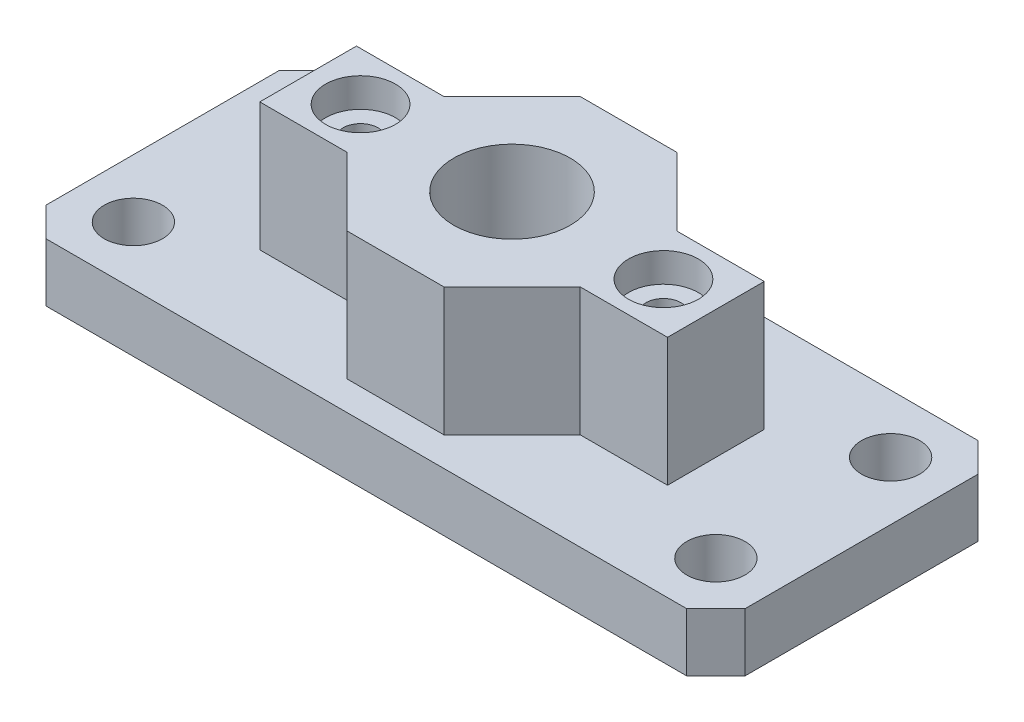
ISO-10303-21;
HEADER;
FILE_DESCRIPTION(('STEP AP214'),'2;1');
FILE_NAME('part.step','',(''),(''),'','','');
FILE_SCHEMA(('AUTOMOTIVE_DESIGN { 1 0 10303 214 1 1 1 1 }'));
ENDSEC;
DATA;
#1=APPLICATION_CONTEXT('core data for automotive mechanical design processes');
#2=APPLICATION_PROTOCOL_DEFINITION('international standard','automotive_design',2000,#1);
#3=PRODUCT_CONTEXT('',#1,'mechanical');
#4=PRODUCT('Part','Part','',(#3));
#5=PRODUCT_RELATED_PRODUCT_CATEGORY('part','',(#4));
#6=PRODUCT_DEFINITION_FORMATION('','',#4);
#7=PRODUCT_DEFINITION_CONTEXT('part definition',#1,'design');
#8=PRODUCT_DEFINITION('design','',#6,#7);
#9=PRODUCT_DEFINITION_SHAPE('','',#8);
#10=(LENGTH_UNIT() NAMED_UNIT(*) SI_UNIT(.MILLI.,.METRE.));
#11=(NAMED_UNIT(*) PLANE_ANGLE_UNIT() SI_UNIT($,.RADIAN.));
#12=(NAMED_UNIT(*) SI_UNIT($,.STERADIAN.) SOLID_ANGLE_UNIT());
#13=UNCERTAINTY_MEASURE_WITH_UNIT(LENGTH_MEASURE(1.E-05),#10,'distance_accuracy_value','');
#14=(GEOMETRIC_REPRESENTATION_CONTEXT(3) GLOBAL_UNCERTAINTY_ASSIGNED_CONTEXT((#13)) GLOBAL_UNIT_ASSIGNED_CONTEXT((#10,
#11,#12)) REPRESENTATION_CONTEXT('',''));
#15=CARTESIAN_POINT('',(0.,0.,0.));
#16=DIRECTION('',(0.,0.,1.));
#17=DIRECTION('',(1.,0.,0.));
#18=AXIS2_PLACEMENT_3D('',#15,#16,#17);
#19=CARTESIAN_POINT('',(60.,10.,0.));
#20=DIRECTION('',(1.,0.,0.));
#21=DIRECTION('',(0.,0.,-1.));
#22=AXIS2_PLACEMENT_3D('',#19,#20,#21);
#23=PLANE('',#22);
#24=DIRECTION('',(0.,0.,1.));
#25=VECTOR('',#24,1.);
#26=CARTESIAN_POINT('',(60.,10.,0.));
#27=LINE('',#26,#25);
#28=CARTESIAN_POINT('',(60.,10.,-20.));
#29=VERTEX_POINT('',#28);
#30=CARTESIAN_POINT('',(60.,10.,20.));
#31=VERTEX_POINT('',#30);
#32=EDGE_CURVE('E275',#29,#31,#27,.T.);
#33=ORIENTED_EDGE('',*,*,#32,.T.);
#34=DIRECTION('',(0.,-1.,0.));
#35=VECTOR('',#34,1.);
#36=CARTESIAN_POINT('',(60.,0.,20.));
#37=LINE('',#36,#35);
#38=CARTESIAN_POINT('',(60.,0.,20.));
#39=VERTEX_POINT('',#38);
#40=EDGE_CURVE('E356',#31,#39,#37,.T.);
#41=ORIENTED_EDGE('',*,*,#40,.T.);
#42=DIRECTION('',(0.,0.,1.));
#43=VECTOR('',#42,1.);
#44=CARTESIAN_POINT('',(60.,0.,0.));
#45=LINE('',#44,#43);
#46=CARTESIAN_POINT('',(60.,0.,-20.));
#47=VERTEX_POINT('',#46);
#48=EDGE_CURVE('E331',#47,#39,#45,.T.);
#49=ORIENTED_EDGE('',*,*,#48,.F.);
#50=DIRECTION('',(0.,1.,0.));
#51=VECTOR('',#50,1.);
#52=CARTESIAN_POINT('',(60.,10.,-20.));
#53=LINE('',#52,#51);
#54=EDGE_CURVE('E325',#47,#29,#53,.T.);
#55=ORIENTED_EDGE('',*,*,#54,.T.);
#56=EDGE_LOOP('',(#33,#41,#49,#55));
#57=FACE_BOUND('',#56,.T.);
#58=ADVANCED_FACE('F39',(#57),#23,.T.);
#59=CARTESIAN_POINT('',(0.,10.,-25.));
#60=DIRECTION('',(0.,0.,-1.));
#61=DIRECTION('',(-1.,0.,0.));
#62=AXIS2_PLACEMENT_3D('',#59,#60,#61);
#63=PLANE('',#62);
#64=DIRECTION('',(1.,0.,0.));
#65=VECTOR('',#64,1.);
#66=CARTESIAN_POINT('',(0.,10.,-25.));
#67=LINE('',#66,#65);
#68=CARTESIAN_POINT('',(-55.,10.,-25.));
#69=VERTEX_POINT('',#68);
#70=CARTESIAN_POINT('',(55.,10.,-25.));
#71=VERTEX_POINT('',#70);
#72=EDGE_CURVE('E278',#69,#71,#67,.T.);
#73=ORIENTED_EDGE('',*,*,#72,.T.);
#74=DIRECTION('',(0.,-1.,0.));
#75=VECTOR('',#74,1.);
#76=CARTESIAN_POINT('',(55.,10.,-25.));
#77=LINE('',#76,#75);
#78=CARTESIAN_POINT('',(55.,0.,-25.));
#79=VERTEX_POINT('',#78);
#80=EDGE_CURVE('E381',#71,#79,#77,.T.);
#81=ORIENTED_EDGE('',*,*,#80,.T.);
#82=DIRECTION('',(1.,0.,0.));
#83=VECTOR('',#82,1.);
#84=CARTESIAN_POINT('',(0.,0.,-25.));
#85=LINE('',#84,#83);
#86=CARTESIAN_POINT('',(-55.,0.,-25.));
#87=VERTEX_POINT('',#86);
#88=EDGE_CURVE('E334',#87,#79,#85,.T.);
#89=ORIENTED_EDGE('',*,*,#88,.F.);
#90=DIRECTION('',(0.,1.,0.));
#91=VECTOR('',#90,1.);
#92=CARTESIAN_POINT('',(-55.,10.,-25.));
#93=LINE('',#92,#91);
#94=EDGE_CURVE('E379',#87,#69,#93,.T.);
#95=ORIENTED_EDGE('',*,*,#94,.T.);
#96=EDGE_LOOP('',(#73,#81,#89,#95));
#97=FACE_BOUND('',#96,.T.);
#98=ADVANCED_FACE('F386',(#97),#63,.T.);
#99=CARTESIAN_POINT('',(-60.,10.,0.));
#100=DIRECTION('',(1.,0.,0.));
#101=DIRECTION('',(0.,0.,-1.));
#102=AXIS2_PLACEMENT_3D('',#99,#100,#101);
#103=PLANE('',#102);
#104=DIRECTION('',(0.,0.,1.));
#105=VECTOR('',#104,1.);
#106=CARTESIAN_POINT('',(-60.,10.,0.));
#107=LINE('',#106,#105);
#108=CARTESIAN_POINT('',(-60.,10.,-20.));
#109=VERTEX_POINT('',#108);
#110=CARTESIAN_POINT('',(-60.,10.,20.));
#111=VERTEX_POINT('',#110);
#112=EDGE_CURVE('E281',#109,#111,#107,.T.);
#113=ORIENTED_EDGE('',*,*,#112,.F.);
#114=DIRECTION('',(0.,-1.,0.));
#115=VECTOR('',#114,1.);
#116=CARTESIAN_POINT('',(-60.,0.,-20.));
#117=LINE('',#116,#115);
#118=CARTESIAN_POINT('',(-60.,0.,-20.));
#119=VERTEX_POINT('',#118);
#120=EDGE_CURVE('E11',#109,#119,#117,.T.);
#121=ORIENTED_EDGE('',*,*,#120,.T.);
#122=DIRECTION('',(0.,0.,1.));
#123=VECTOR('',#122,1.);
#124=CARTESIAN_POINT('',(-60.,0.,0.));
#125=LINE('',#124,#123);
#126=CARTESIAN_POINT('',(-60.,0.,20.));
#127=VERTEX_POINT('',#126);
#128=EDGE_CURVE('E337',#119,#127,#125,.T.);
#129=ORIENTED_EDGE('',*,*,#128,.T.);
#130=DIRECTION('',(0.,1.,0.));
#131=VECTOR('',#130,1.);
#132=CARTESIAN_POINT('',(-60.,10.,20.));
#133=LINE('',#132,#131);
#134=EDGE_CURVE('E48',#127,#111,#133,.T.);
#135=ORIENTED_EDGE('',*,*,#134,.T.);
#136=EDGE_LOOP('',(#113,#121,#129,#135));
#137=FACE_BOUND('',#136,.T.);
#138=ADVANCED_FACE('F398',(#137),#103,.F.);
#139=CARTESIAN_POINT('',(-49.9999999999999,10.,15.0000000000004));
#140=DIRECTION('',(0.,-1.,0.));
#141=DIRECTION('',(0.,0.,-1.));
#142=AXIS2_PLACEMENT_3D('',#139,#140,#141);
#143=CYLINDRICAL_SURFACE('',#142,4.99999999999998);
#144=CARTESIAN_POINT('',(-49.9999999999999,10.,15.0000000000004));
#145=DIRECTION('',(0.,1.,0.));
#146=DIRECTION('',(0.,0.,1.));
#147=AXIS2_PLACEMENT_3D('',#144,#145,#146);
#148=CIRCLE('',#147,4.99999999999998);
#149=CARTESIAN_POINT('',(-49.9999999999999,10.,20.0000000000004));
#150=VERTEX_POINT('',#149);
#151=EDGE_CURVE('E319',#150,#150,#148,.T.);
#152=ORIENTED_EDGE('',*,*,#151,.T.);
#153=EDGE_LOOP('',(#152));
#154=FACE_BOUND('',#153,.T.);
#155=CARTESIAN_POINT('',(-49.9999999999999,0.,15.0000000000004));
#156=DIRECTION('',(0.,1.,0.));
#157=DIRECTION('',(0.,0.,1.));
#158=AXIS2_PLACEMENT_3D('',#155,#156,#157);
#159=CIRCLE('',#158,4.99999999999998);
#160=CARTESIAN_POINT('',(-49.9999999999999,0.,20.0000000000004));
#161=VERTEX_POINT('',#160);
#162=EDGE_CURVE('E342',#161,#161,#159,.T.);
#163=ORIENTED_EDGE('',*,*,#162,.F.);
#164=EDGE_LOOP('',(#163));
#165=FACE_BOUND('',#164,.T.);
#166=ADVANCED_FACE('F475',(#154,#165),#143,.F.);
#167=CARTESIAN_POINT('',(0.,10.,25.));
#168=DIRECTION('',(0.,0.,-1.));
#169=DIRECTION('',(-1.,0.,0.));
#170=AXIS2_PLACEMENT_3D('',#167,#168,#169);
#171=PLANE('',#170);
#172=DIRECTION('',(1.,0.,0.));
#173=VECTOR('',#172,1.);
#174=CARTESIAN_POINT('',(0.,0.,25.));
#175=LINE('',#174,#173);
#176=CARTESIAN_POINT('',(-55.,0.,25.));
#177=VERTEX_POINT('',#176);
#178=CARTESIAN_POINT('',(55.,0.,25.));
#179=VERTEX_POINT('',#178);
#180=EDGE_CURVE('E339',#177,#179,#175,.T.);
#181=ORIENTED_EDGE('',*,*,#180,.T.);
#182=DIRECTION('',(0.,1.,0.));
#183=VECTOR('',#182,1.);
#184=CARTESIAN_POINT('',(55.,10.,25.));
#185=LINE('',#184,#183);
#186=CARTESIAN_POINT('',(55.,10.,25.));
#187=VERTEX_POINT('',#186);
#188=EDGE_CURVE('E370',#179,#187,#185,.T.);
#189=ORIENTED_EDGE('',*,*,#188,.T.);
#190=DIRECTION('',(1.,0.,0.));
#191=VECTOR('',#190,1.);
#192=CARTESIAN_POINT('',(0.,10.,25.));
#193=LINE('',#192,#191);
#194=CARTESIAN_POINT('',(-55.,10.,25.));
#195=VERTEX_POINT('',#194);
#196=EDGE_CURVE('E283',#195,#187,#193,.T.);
#197=ORIENTED_EDGE('',*,*,#196,.F.);
#198=DIRECTION('',(0.,-1.,0.));
#199=VECTOR('',#198,1.);
#200=CARTESIAN_POINT('',(-55.,10.,25.));
#201=LINE('',#200,#199);
#202=EDGE_CURVE('E367',#195,#177,#201,.T.);
#203=ORIENTED_EDGE('',*,*,#202,.T.);
#204=EDGE_LOOP('',(#181,#189,#197,#203));
#205=FACE_BOUND('',#204,.T.);
#206=ADVANCED_FACE('F407',(#205),#171,.F.);
#207=CARTESIAN_POINT('',(50.,10.,-15.));
#208=DIRECTION('',(0.,-1.,0.));
#209=DIRECTION('',(0.,0.,-1.));
#210=AXIS2_PLACEMENT_3D('',#207,#208,#209);
#211=CYLINDRICAL_SURFACE('',#210,5.);
#212=CARTESIAN_POINT('',(50.,10.,-15.));
#213=DIRECTION('',(0.,1.,0.));
#214=DIRECTION('',(0.,0.,1.));
#215=AXIS2_PLACEMENT_3D('',#212,#213,#214);
#216=CIRCLE('',#215,5.);
#217=CARTESIAN_POINT('',(50.,10.,-10.));
#218=VERTEX_POINT('',#217);
#219=EDGE_CURVE('E271',#218,#218,#216,.T.);
#220=ORIENTED_EDGE('',*,*,#219,.T.);
#221=EDGE_LOOP('',(#220));
#222=FACE_BOUND('',#221,.T.);
#223=CARTESIAN_POINT('',(50.,0.,-15.));
#224=DIRECTION('',(0.,1.,0.));
#225=DIRECTION('',(0.,0.,1.));
#226=AXIS2_PLACEMENT_3D('',#223,#224,#225);
#227=CIRCLE('',#226,5.);
#228=CARTESIAN_POINT('',(50.,0.,-10.));
#229=VERTEX_POINT('',#228);
#230=EDGE_CURVE('E328',#229,#229,#227,.T.);
#231=ORIENTED_EDGE('',*,*,#230,.F.);
#232=EDGE_LOOP('',(#231));
#233=FACE_BOUND('',#232,.T.);
#234=ADVANCED_FACE('F434',(#222,#233),#211,.F.);
#235=CARTESIAN_POINT('',(50.,10.,15.));
#236=DIRECTION('',(0.,-1.,0.));
#237=DIRECTION('',(0.,0.,-1.));
#238=AXIS2_PLACEMENT_3D('',#235,#236,#237);
#239=CYLINDRICAL_SURFACE('',#238,5.);
#240=CARTESIAN_POINT('',(50.,10.,15.));
#241=DIRECTION('',(0.,1.,0.));
#242=DIRECTION('',(0.,0.,1.));
#243=AXIS2_PLACEMENT_3D('',#240,#241,#242);
#244=CIRCLE('',#243,5.);
#245=CARTESIAN_POINT('',(50.,10.,20.));
#246=VERTEX_POINT('',#245);
#247=EDGE_CURVE('E268',#246,#246,#244,.F.);
#248=ORIENTED_EDGE('',*,*,#247,.F.);
#249=EDGE_LOOP('',(#248));
#250=FACE_BOUND('',#249,.T.);
#251=CARTESIAN_POINT('',(50.,0.,15.));
#252=DIRECTION('',(0.,1.,0.));
#253=DIRECTION('',(0.,0.,1.));
#254=AXIS2_PLACEMENT_3D('',#251,#252,#253);
#255=CIRCLE('',#254,5.);
#256=CARTESIAN_POINT('',(50.,0.,20.));
#257=VERTEX_POINT('',#256);
#258=EDGE_CURVE('E189',#257,#257,#255,.F.);
#259=ORIENTED_EDGE('',*,*,#258,.T.);
#260=EDGE_LOOP('',(#259));
#261=FACE_BOUND('',#260,.T.);
#262=ADVANCED_FACE('F437',(#250,#261),#239,.F.);
#263=CARTESIAN_POINT('',(-50.0000000000001,10.,-14.9999999999996));
#264=DIRECTION('',(0.,-1.,0.));
#265=DIRECTION('',(0.,0.,-1.));
#266=AXIS2_PLACEMENT_3D('',#263,#264,#265);
#267=CYLINDRICAL_SURFACE('',#266,5.);
#268=CARTESIAN_POINT('',(-50.0000000000001,10.,-14.9999999999996));
#269=DIRECTION('',(0.,1.,0.));
#270=DIRECTION('',(0.,0.,1.));
#271=AXIS2_PLACEMENT_3D('',#268,#269,#270);
#272=CIRCLE('',#271,5.);
#273=CARTESIAN_POINT('',(-50.0000000000001,10.,-9.99999999999956));
#274=VERTEX_POINT('',#273);
#275=EDGE_CURVE('E322',#274,#274,#272,.F.);
#276=ORIENTED_EDGE('',*,*,#275,.F.);
#277=EDGE_LOOP('',(#276));
#278=FACE_BOUND('',#277,.T.);
#279=CARTESIAN_POINT('',(-50.0000000000001,0.,-14.9999999999996));
#280=DIRECTION('',(0.,1.,0.));
#281=DIRECTION('',(0.,0.,1.));
#282=AXIS2_PLACEMENT_3D('',#279,#280,#281);
#283=CIRCLE('',#282,5.);
#284=CARTESIAN_POINT('',(-50.0000000000001,0.,-9.99999999999956));
#285=VERTEX_POINT('',#284);
#286=EDGE_CURVE('E272',#285,#285,#283,.F.);
#287=ORIENTED_EDGE('',*,*,#286,.T.);
#288=EDGE_LOOP('',(#287));
#289=FACE_BOUND('',#288,.T.);
#290=ADVANCED_FACE('F440',(#278,#289),#267,.F.);
#291=CARTESIAN_POINT('',(0.,10.,0.));
#292=DIRECTION('',(0.,1.,0.));
#293=DIRECTION('',(0.,0.,1.));
#294=AXIS2_PLACEMENT_3D('',#291,#292,#293);
#295=PLANE('',#294);
#296=ORIENTED_EDGE('',*,*,#247,.T.);
#297=EDGE_LOOP('',(#296));
#298=FACE_BOUND('',#297,.T.);
#299=ORIENTED_EDGE('',*,*,#219,.F.);
#300=EDGE_LOOP('',(#299));
#301=FACE_BOUND('',#300,.T.);
#302=ORIENTED_EDGE('',*,*,#196,.T.);
#303=DIRECTION('',(0.707106781186548,0.,-0.707106781186547));
#304=VECTOR('',#303,1.);
#305=CARTESIAN_POINT('',(40.,10.,40.));
#306=LINE('',#305,#304);
#307=EDGE_CURVE('E377',#187,#31,#306,.T.);
#308=ORIENTED_EDGE('',*,*,#307,.T.);
#309=ORIENTED_EDGE('',*,*,#32,.F.);
#310=DIRECTION('',(0.707106781186547,0.,0.707106781186548));
#311=VECTOR('',#310,1.);
#312=CARTESIAN_POINT('',(40.,10.,-40.));
#313=LINE('',#312,#311);
#314=EDGE_CURVE('E375',#29,#71,#313,.F.);
#315=ORIENTED_EDGE('',*,*,#314,.T.);
#316=ORIENTED_EDGE('',*,*,#72,.F.);
#317=DIRECTION('',(-0.707106781186549,0.,0.707106781186547));
#318=VECTOR('',#317,1.);
#319=CARTESIAN_POINT('',(-39.9999999999999,10.,-40.));
#320=LINE('',#319,#318);
#321=EDGE_CURVE('E61',#69,#109,#320,.T.);
#322=ORIENTED_EDGE('',*,*,#321,.T.);
#323=ORIENTED_EDGE('',*,*,#112,.T.);
#324=DIRECTION('',(-0.707106781186547,0.,-0.707106781186549));
#325=VECTOR('',#324,1.);
#326=CARTESIAN_POINT('',(-40.0000000000001,10.,40.));
#327=LINE('',#326,#325);
#328=EDGE_CURVE('E372',#111,#195,#327,.F.);
#329=ORIENTED_EDGE('',*,*,#328,.T.);
#330=EDGE_LOOP('',(#302,#308,#309,#315,#316,#322,#323,#329));
#331=FACE_BOUND('',#330,.T.);
#332=DIRECTION('',(-0.707106781186548,0.,-0.707106781186548));
#333=VECTOR('',#332,1.);
#334=CARTESIAN_POINT('',(-14.15,10.,14.15));
#335=LINE('',#334,#333);
#336=CARTESIAN_POINT('',(-8.30000000000003,10.,20.));
#337=VERTEX_POINT('',#336);
#338=CARTESIAN_POINT('',(-20.,10.,8.3));
#339=VERTEX_POINT('',#338);
#340=EDGE_CURVE('E286',#337,#339,#335,.T.);
#341=ORIENTED_EDGE('',*,*,#340,.T.);
#342=DIRECTION('',(-1.,0.,0.));
#343=VECTOR('',#342,1.);
#344=CARTESIAN_POINT('',(0.,10.,8.3));
#345=LINE('',#344,#343);
#346=CARTESIAN_POINT('',(-35.,10.,8.3));
#347=VERTEX_POINT('',#346);
#348=EDGE_CURVE('E185',#339,#347,#345,.T.);
#349=ORIENTED_EDGE('',*,*,#348,.T.);
#350=DIRECTION('',(0.,0.,-1.));
#351=VECTOR('',#350,1.);
#352=CARTESIAN_POINT('',(-35.,10.,0.));
#353=LINE('',#352,#351);
#354=CARTESIAN_POINT('',(-35.,10.,-8.3));
#355=VERTEX_POINT('',#354);
#356=EDGE_CURVE('E289',#347,#355,#353,.T.);
#357=ORIENTED_EDGE('',*,*,#356,.T.);
#358=DIRECTION('',(1.,0.,0.));
#359=VECTOR('',#358,1.);
#360=CARTESIAN_POINT('',(0.,10.,-8.3));
#361=LINE('',#360,#359);
#362=CARTESIAN_POINT('',(-20.,10.,-8.3));
#363=VERTEX_POINT('',#362);
#364=EDGE_CURVE('E292',#355,#363,#361,.T.);
#365=ORIENTED_EDGE('',*,*,#364,.T.);
#366=DIRECTION('',(0.707106781186548,0.,-0.707106781186548));
#367=VECTOR('',#366,1.);
#368=CARTESIAN_POINT('',(-14.15,10.,-14.15));
#369=LINE('',#368,#367);
#370=CARTESIAN_POINT('',(-8.30000000000003,10.,-20.));
#371=VERTEX_POINT('',#370);
#372=EDGE_CURVE('E295',#363,#371,#369,.T.);
#373=ORIENTED_EDGE('',*,*,#372,.T.);
#374=DIRECTION('',(1.,0.,0.));
#375=VECTOR('',#374,1.);
#376=CARTESIAN_POINT('',(0.,10.,-20.));
#377=LINE('',#376,#375);
#378=CARTESIAN_POINT('',(8.29999999999997,10.,-20.));
#379=VERTEX_POINT('',#378);
#380=EDGE_CURVE('E298',#371,#379,#377,.T.);
#381=ORIENTED_EDGE('',*,*,#380,.T.);
#382=DIRECTION('',(0.707106781186548,0.,0.707106781186547));
#383=VECTOR('',#382,1.);
#384=CARTESIAN_POINT('',(14.15,10.,-14.15));
#385=LINE('',#384,#383);
#386=CARTESIAN_POINT('',(20.,10.,-8.30000000000001));
#387=VERTEX_POINT('',#386);
#388=EDGE_CURVE('E301',#379,#387,#385,.T.);
#389=ORIENTED_EDGE('',*,*,#388,.T.);
#390=DIRECTION('',(1.,0.,0.));
#391=VECTOR('',#390,1.);
#392=CARTESIAN_POINT('',(0.,10.,-8.30000000000001));
#393=LINE('',#392,#391);
#394=CARTESIAN_POINT('',(35.,10.,-8.3));
#395=VERTEX_POINT('',#394);
#396=EDGE_CURVE('E304',#387,#395,#393,.T.);
#397=ORIENTED_EDGE('',*,*,#396,.T.);
#398=DIRECTION('',(0.,0.,1.));
#399=VECTOR('',#398,1.);
#400=CARTESIAN_POINT('',(35.,10.,0.));
#401=LINE('',#400,#399);
#402=CARTESIAN_POINT('',(35.,10.,8.29999999999999));
#403=VERTEX_POINT('',#402);
#404=EDGE_CURVE('E307',#395,#403,#401,.T.);
#405=ORIENTED_EDGE('',*,*,#404,.T.);
#406=DIRECTION('',(-1.,0.,0.));
#407=VECTOR('',#406,1.);
#408=CARTESIAN_POINT('',(0.,10.,8.3));
#409=LINE('',#408,#407);
#410=CARTESIAN_POINT('',(20.,10.,8.29999999999999));
#411=VERTEX_POINT('',#410);
#412=EDGE_CURVE('E310',#403,#411,#409,.T.);
#413=ORIENTED_EDGE('',*,*,#412,.T.);
#414=DIRECTION('',(-0.707106781186547,0.,0.707106781186548));
#415=VECTOR('',#414,1.);
#416=CARTESIAN_POINT('',(14.15,10.,14.15));
#417=LINE('',#416,#415);
#418=CARTESIAN_POINT('',(8.29999999999999,10.,20.));
#419=VERTEX_POINT('',#418);
#420=EDGE_CURVE('E313',#411,#419,#417,.T.);
#421=ORIENTED_EDGE('',*,*,#420,.T.);
#422=DIRECTION('',(-1.,0.,0.));
#423=VECTOR('',#422,1.);
#424=CARTESIAN_POINT('',(0.,10.,20.));
#425=LINE('',#424,#423);
#426=EDGE_CURVE('E316',#419,#337,#425,.T.);
#427=ORIENTED_EDGE('',*,*,#426,.T.);
#428=EDGE_LOOP('',(#341,#349,#357,#365,#373,#381,#389,#397,#405,#413,#421,#427));
#429=FACE_BOUND('',#428,.T.);
#430=ORIENTED_EDGE('',*,*,#151,.F.);
#431=EDGE_LOOP('',(#430));
#432=FACE_BOUND('',#431,.T.);
#433=ORIENTED_EDGE('',*,*,#275,.T.);
#434=EDGE_LOOP('',(#433));
#435=FACE_BOUND('',#434,.T.);
#436=ADVANCED_FACE('F400',(#298,#301,#331,#429,#432,#435),#295,.T.);
#437=CARTESIAN_POINT('',(0.,0.,0.));
#438=DIRECTION('',(0.,1.,0.));
#439=DIRECTION('',(0.,0.,1.));
#440=AXIS2_PLACEMENT_3D('',#437,#438,#439);
#441=PLANE('',#440);
#442=ORIENTED_EDGE('',*,*,#258,.F.);
#443=EDGE_LOOP('',(#442));
#444=FACE_BOUND('',#443,.T.);
#445=ORIENTED_EDGE('',*,*,#230,.T.);
#446=EDGE_LOOP('',(#445));
#447=FACE_BOUND('',#446,.T.);
#448=ORIENTED_EDGE('',*,*,#48,.T.);
#449=DIRECTION('',(-0.707106781186548,0.,0.707106781186547));
#450=VECTOR('',#449,1.);
#451=CARTESIAN_POINT('',(60.,0.,20.));
#452=LINE('',#451,#450);
#453=EDGE_CURVE('E365',#39,#179,#452,.T.);
#454=ORIENTED_EDGE('',*,*,#453,.T.);
#455=ORIENTED_EDGE('',*,*,#180,.F.);
#456=DIRECTION('',(0.707106781186547,0.,0.707106781186549));
#457=VECTOR('',#456,1.);
#458=CARTESIAN_POINT('',(-55.,0.,25.));
#459=LINE('',#458,#457);
#460=EDGE_CURVE('E359',#177,#127,#459,.F.);
#461=ORIENTED_EDGE('',*,*,#460,.T.);
#462=ORIENTED_EDGE('',*,*,#128,.F.);
#463=DIRECTION('',(0.707106781186549,0.,-0.707106781186547));
#464=VECTOR('',#463,1.);
#465=CARTESIAN_POINT('',(-60.,0.,-20.));
#466=LINE('',#465,#464);
#467=EDGE_CURVE('E361',#119,#87,#466,.T.);
#468=ORIENTED_EDGE('',*,*,#467,.T.);
#469=ORIENTED_EDGE('',*,*,#88,.T.);
#470=DIRECTION('',(-0.707106781186547,0.,-0.707106781186548));
#471=VECTOR('',#470,1.);
#472=CARTESIAN_POINT('',(55.,0.,-25.));
#473=LINE('',#472,#471);
#474=EDGE_CURVE('E363',#79,#47,#473,.F.);
#475=ORIENTED_EDGE('',*,*,#474,.T.);
#476=EDGE_LOOP('',(#448,#454,#455,#461,#462,#468,#469,#475));
#477=FACE_BOUND('',#476,.T.);
#478=ORIENTED_EDGE('',*,*,#162,.T.);
#479=EDGE_LOOP('',(#478));
#480=FACE_BOUND('',#479,.T.);
#481=ORIENTED_EDGE('',*,*,#286,.F.);
#482=EDGE_LOOP('',(#481));
#483=FACE_BOUND('',#482,.T.);
#484=CARTESIAN_POINT('',(0.,0.,0.));
#485=DIRECTION('',(0.,1.,0.));
#486=DIRECTION('',(0.,0.,1.));
#487=AXIS2_PLACEMENT_3D('',#484,#485,#486);
#488=CIRCLE('',#487,10.);
#489=CARTESIAN_POINT('',(0.,0.,10.));
#490=VERTEX_POINT('',#489);
#491=EDGE_CURVE('E236',#490,#490,#488,.T.);
#492=ORIENTED_EDGE('',*,*,#491,.T.);
#493=EDGE_LOOP('',(#492));
#494=FACE_BOUND('',#493,.T.);
#495=ADVANCED_FACE('F391',(#444,#447,#477,#480,#483,#494),#441,.F.);
#496=CARTESIAN_POINT('',(0.,32.,8.3));
#497=DIRECTION('',(0.,0.,1.));
#498=DIRECTION('',(1.,0.,0.));
#499=AXIS2_PLACEMENT_3D('',#496,#497,#498);
#500=PLANE('',#499);
#501=DIRECTION('',(0.,-1.,0.));
#502=VECTOR('',#501,1.);
#503=CARTESIAN_POINT('',(-35.,32.,8.3));
#504=LINE('',#503,#502);
#505=CARTESIAN_POINT('',(-35.,32.,8.3));
#506=VERTEX_POINT('',#505);
#507=EDGE_CURVE('E235',#506,#347,#504,.T.);
#508=ORIENTED_EDGE('',*,*,#507,.T.);
#509=ORIENTED_EDGE('',*,*,#348,.F.);
#510=DIRECTION('',(0.,-1.,0.));
#511=VECTOR('',#510,1.);
#512=CARTESIAN_POINT('',(-20.,32.,8.3));
#513=LINE('',#512,#511);
#514=CARTESIAN_POINT('',(-20.,32.,8.3));
#515=VERTEX_POINT('',#514);
#516=EDGE_CURVE('E178',#515,#339,#513,.T.);
#517=ORIENTED_EDGE('',*,*,#516,.F.);
#518=DIRECTION('',(-1.,0.,0.));
#519=VECTOR('',#518,1.);
#520=CARTESIAN_POINT('',(0.,32.,8.3));
#521=LINE('',#520,#519);
#522=EDGE_CURVE('E182',#515,#506,#521,.T.);
#523=ORIENTED_EDGE('',*,*,#522,.T.);
#524=EDGE_LOOP('',(#508,#509,#517,#523));
#525=FACE_BOUND('',#524,.T.);
#526=ADVANCED_FACE('F181',(#525),#500,.T.);
#527=CARTESIAN_POINT('',(-14.15,32.,14.15));
#528=DIRECTION('',(-0.707106781186547,0.,0.707106781186547));
#529=DIRECTION('',(0.707106781186548,0.,0.707106781186548));
#530=AXIS2_PLACEMENT_3D('',#527,#528,#529);
#531=PLANE('',#530);
#532=ORIENTED_EDGE('',*,*,#516,.T.);
#533=ORIENTED_EDGE('',*,*,#340,.F.);
#534=DIRECTION('',(0.,-1.,0.));
#535=VECTOR('',#534,1.);
#536=CARTESIAN_POINT('',(-8.30000000000003,32.,20.));
#537=LINE('',#536,#535);
#538=CARTESIAN_POINT('',(-8.30000000000003,32.,20.));
#539=VERTEX_POINT('',#538);
#540=EDGE_CURVE('E190',#539,#337,#537,.T.);
#541=ORIENTED_EDGE('',*,*,#540,.F.);
#542=DIRECTION('',(-0.707106781186548,0.,-0.707106781186548));
#543=VECTOR('',#542,1.);
#544=CARTESIAN_POINT('',(-14.15,32.,14.15));
#545=LINE('',#544,#543);
#546=EDGE_CURVE('E196',#539,#515,#545,.T.);
#547=ORIENTED_EDGE('',*,*,#546,.T.);
#548=EDGE_LOOP('',(#532,#533,#541,#547));
#549=FACE_BOUND('',#548,.T.);
#550=ADVANCED_FACE('F203',(#549),#531,.T.);
#551=CARTESIAN_POINT('',(0.,32.,20.));
#552=DIRECTION('',(0.,0.,1.));
#553=DIRECTION('',(1.,0.,0.));
#554=AXIS2_PLACEMENT_3D('',#551,#552,#553);
#555=PLANE('',#554);
#556=ORIENTED_EDGE('',*,*,#540,.T.);
#557=ORIENTED_EDGE('',*,*,#426,.F.);
#558=DIRECTION('',(0.,-1.,0.));
#559=VECTOR('',#558,1.);
#560=CARTESIAN_POINT('',(8.29999999999999,32.,20.));
#561=LINE('',#560,#559);
#562=CARTESIAN_POINT('',(8.29999999999999,32.,20.));
#563=VERTEX_POINT('',#562);
#564=EDGE_CURVE('E264',#563,#419,#561,.T.);
#565=ORIENTED_EDGE('',*,*,#564,.F.);
#566=DIRECTION('',(-1.,0.,0.));
#567=VECTOR('',#566,1.);
#568=CARTESIAN_POINT('',(0.,32.,20.));
#569=LINE('',#568,#567);
#570=EDGE_CURVE('E205',#563,#539,#569,.T.);
#571=ORIENTED_EDGE('',*,*,#570,.T.);
#572=EDGE_LOOP('',(#556,#557,#565,#571));
#573=FACE_BOUND('',#572,.T.);
#574=ADVANCED_FACE('F529',(#573),#555,.T.);
#575=CARTESIAN_POINT('',(14.15,32.,14.15));
#576=DIRECTION('',(0.707106781186548,0.,0.707106781186547));
#577=DIRECTION('',(0.707106781186547,0.,-0.707106781186548));
#578=AXIS2_PLACEMENT_3D('',#575,#576,#577);
#579=PLANE('',#578);
#580=ORIENTED_EDGE('',*,*,#564,.T.);
#581=ORIENTED_EDGE('',*,*,#420,.F.);
#582=DIRECTION('',(0.,-1.,0.));
#583=VECTOR('',#582,1.);
#584=CARTESIAN_POINT('',(20.,32.,8.29999999999999));
#585=LINE('',#584,#583);
#586=CARTESIAN_POINT('',(20.,32.,8.29999999999999));
#587=VERTEX_POINT('',#586);
#588=EDGE_CURVE('E261',#587,#411,#585,.T.);
#589=ORIENTED_EDGE('',*,*,#588,.F.);
#590=DIRECTION('',(-0.707106781186547,0.,0.707106781186548));
#591=VECTOR('',#590,1.);
#592=CARTESIAN_POINT('',(14.15,32.,14.15));
#593=LINE('',#592,#591);
#594=EDGE_CURVE('E207',#587,#563,#593,.T.);
#595=ORIENTED_EDGE('',*,*,#594,.T.);
#596=EDGE_LOOP('',(#580,#581,#589,#595));
#597=FACE_BOUND('',#596,.T.);
#598=ADVANCED_FACE('F539',(#597),#579,.T.);
#599=CARTESIAN_POINT('',(0.,32.,8.3));
#600=DIRECTION('',(0.,0.,1.));
#601=DIRECTION('',(1.,0.,0.));
#602=AXIS2_PLACEMENT_3D('',#599,#600,#601);
#603=PLANE('',#602);
#604=ORIENTED_EDGE('',*,*,#588,.T.);
#605=ORIENTED_EDGE('',*,*,#412,.F.);
#606=DIRECTION('',(0.,-1.,0.));
#607=VECTOR('',#606,1.);
#608=CARTESIAN_POINT('',(35.,32.,8.29999999999999));
#609=LINE('',#608,#607);
#610=CARTESIAN_POINT('',(35.,32.,8.29999999999999));
#611=VERTEX_POINT('',#610);
#612=EDGE_CURVE('E258',#611,#403,#609,.T.);
#613=ORIENTED_EDGE('',*,*,#612,.F.);
#614=DIRECTION('',(-1.,0.,0.));
#615=VECTOR('',#614,1.);
#616=CARTESIAN_POINT('',(0.,32.,8.3));
#617=LINE('',#616,#615);
#618=EDGE_CURVE('E213',#611,#587,#617,.T.);
#619=ORIENTED_EDGE('',*,*,#618,.T.);
#620=EDGE_LOOP('',(#604,#605,#613,#619));
#621=FACE_BOUND('',#620,.T.);
#622=ADVANCED_FACE('F550',(#621),#603,.T.);
#623=CARTESIAN_POINT('',(35.,32.,0.));
#624=DIRECTION('',(1.,0.,0.));
#625=DIRECTION('',(0.,0.,-1.));
#626=AXIS2_PLACEMENT_3D('',#623,#624,#625);
#627=PLANE('',#626);
#628=ORIENTED_EDGE('',*,*,#612,.T.);
#629=ORIENTED_EDGE('',*,*,#404,.F.);
#630=DIRECTION('',(0.,-1.,0.));
#631=VECTOR('',#630,1.);
#632=CARTESIAN_POINT('',(35.,32.,-8.3));
#633=LINE('',#632,#631);
#634=CARTESIAN_POINT('',(35.,32.,-8.3));
#635=VERTEX_POINT('',#634);
#636=EDGE_CURVE('E255',#635,#395,#633,.T.);
#637=ORIENTED_EDGE('',*,*,#636,.F.);
#638=DIRECTION('',(0.,0.,1.));
#639=VECTOR('',#638,1.);
#640=CARTESIAN_POINT('',(35.,32.,0.));
#641=LINE('',#640,#639);
#642=EDGE_CURVE('E216',#635,#611,#641,.T.);
#643=ORIENTED_EDGE('',*,*,#642,.T.);
#644=EDGE_LOOP('',(#628,#629,#637,#643));
#645=FACE_BOUND('',#644,.T.);
#646=ADVANCED_FACE('F561',(#645),#627,.T.);
#647=CARTESIAN_POINT('',(0.,32.,-8.30000000000001));
#648=DIRECTION('',(0.,0.,-1.));
#649=DIRECTION('',(-1.,0.,0.));
#650=AXIS2_PLACEMENT_3D('',#647,#648,#649);
#651=PLANE('',#650);
#652=ORIENTED_EDGE('',*,*,#636,.T.);
#653=ORIENTED_EDGE('',*,*,#396,.F.);
#654=DIRECTION('',(0.,-1.,0.));
#655=VECTOR('',#654,1.);
#656=CARTESIAN_POINT('',(20.,32.,-8.30000000000001));
#657=LINE('',#656,#655);
#658=CARTESIAN_POINT('',(20.,32.,-8.30000000000001));
#659=VERTEX_POINT('',#658);
#660=EDGE_CURVE('E252',#659,#387,#657,.T.);
#661=ORIENTED_EDGE('',*,*,#660,.F.);
#662=DIRECTION('',(1.,0.,0.));
#663=VECTOR('',#662,1.);
#664=CARTESIAN_POINT('',(0.,32.,-8.30000000000001));
#665=LINE('',#664,#663);
#666=EDGE_CURVE('E219',#659,#635,#665,.T.);
#667=ORIENTED_EDGE('',*,*,#666,.T.);
#668=EDGE_LOOP('',(#652,#653,#661,#667));
#669=FACE_BOUND('',#668,.T.);
#670=ADVANCED_FACE('F572',(#669),#651,.T.);
#671=CARTESIAN_POINT('',(14.15,32.,-14.15));
#672=DIRECTION('',(0.707106781186547,0.,-0.707106781186548));
#673=DIRECTION('',(-0.707106781186548,0.,-0.707106781186547));
#674=AXIS2_PLACEMENT_3D('',#671,#672,#673);
#675=PLANE('',#674);
#676=ORIENTED_EDGE('',*,*,#660,.T.);
#677=ORIENTED_EDGE('',*,*,#388,.F.);
#678=DIRECTION('',(0.,-1.,0.));
#679=VECTOR('',#678,1.);
#680=CARTESIAN_POINT('',(8.29999999999997,32.,-20.));
#681=LINE('',#680,#679);
#682=CARTESIAN_POINT('',(8.29999999999997,32.,-20.));
#683=VERTEX_POINT('',#682);
#684=EDGE_CURVE('E249',#683,#379,#681,.T.);
#685=ORIENTED_EDGE('',*,*,#684,.F.);
#686=DIRECTION('',(0.707106781186548,0.,0.707106781186547));
#687=VECTOR('',#686,1.);
#688=CARTESIAN_POINT('',(14.15,32.,-14.15));
#689=LINE('',#688,#687);
#690=EDGE_CURVE('E222',#683,#659,#689,.T.);
#691=ORIENTED_EDGE('',*,*,#690,.T.);
#692=EDGE_LOOP('',(#676,#677,#685,#691));
#693=FACE_BOUND('',#692,.T.);
#694=ADVANCED_FACE('F583',(#693),#675,.T.);
#695=CARTESIAN_POINT('',(0.,32.,-20.));
#696=DIRECTION('',(0.,0.,-1.));
#697=DIRECTION('',(-1.,0.,0.));
#698=AXIS2_PLACEMENT_3D('',#695,#696,#697);
#699=PLANE('',#698);
#700=ORIENTED_EDGE('',*,*,#684,.T.);
#701=ORIENTED_EDGE('',*,*,#380,.F.);
#702=DIRECTION('',(0.,-1.,0.));
#703=VECTOR('',#702,1.);
#704=CARTESIAN_POINT('',(-8.30000000000003,32.,-20.));
#705=LINE('',#704,#703);
#706=CARTESIAN_POINT('',(-8.30000000000003,32.,-20.));
#707=VERTEX_POINT('',#706);
#708=EDGE_CURVE('E246',#707,#371,#705,.T.);
#709=ORIENTED_EDGE('',*,*,#708,.F.);
#710=DIRECTION('',(1.,0.,0.));
#711=VECTOR('',#710,1.);
#712=CARTESIAN_POINT('',(0.,32.,-20.));
#713=LINE('',#712,#711);
#714=EDGE_CURVE('E225',#707,#683,#713,.T.);
#715=ORIENTED_EDGE('',*,*,#714,.T.);
#716=EDGE_LOOP('',(#700,#701,#709,#715));
#717=FACE_BOUND('',#716,.T.);
#718=ADVANCED_FACE('F594',(#717),#699,.T.);
#719=CARTESIAN_POINT('',(-14.15,32.,-14.15));
#720=DIRECTION('',(-0.707106781186547,0.,-0.707106781186547));
#721=DIRECTION('',(-0.707106781186548,0.,0.707106781186548));
#722=AXIS2_PLACEMENT_3D('',#719,#720,#721);
#723=PLANE('',#722);
#724=ORIENTED_EDGE('',*,*,#708,.T.);
#725=ORIENTED_EDGE('',*,*,#372,.F.);
#726=DIRECTION('',(0.,-1.,0.));
#727=VECTOR('',#726,1.);
#728=CARTESIAN_POINT('',(-20.,32.,-8.3));
#729=LINE('',#728,#727);
#730=CARTESIAN_POINT('',(-20.,32.,-8.3));
#731=VERTEX_POINT('',#730);
#732=EDGE_CURVE('E243',#731,#363,#729,.T.);
#733=ORIENTED_EDGE('',*,*,#732,.F.);
#734=DIRECTION('',(0.707106781186548,0.,-0.707106781186548));
#735=VECTOR('',#734,1.);
#736=CARTESIAN_POINT('',(-14.15,32.,-14.15));
#737=LINE('',#736,#735);
#738=EDGE_CURVE('E228',#731,#707,#737,.T.);
#739=ORIENTED_EDGE('',*,*,#738,.T.);
#740=EDGE_LOOP('',(#724,#725,#733,#739));
#741=FACE_BOUND('',#740,.T.);
#742=ADVANCED_FACE('F605',(#741),#723,.T.);
#743=CARTESIAN_POINT('',(0.,32.,-8.3));
#744=DIRECTION('',(0.,0.,-1.));
#745=DIRECTION('',(-1.,0.,0.));
#746=AXIS2_PLACEMENT_3D('',#743,#744,#745);
#747=PLANE('',#746);
#748=ORIENTED_EDGE('',*,*,#732,.T.);
#749=ORIENTED_EDGE('',*,*,#364,.F.);
#750=DIRECTION('',(0.,-1.,0.));
#751=VECTOR('',#750,1.);
#752=CARTESIAN_POINT('',(-35.,32.,-8.3));
#753=LINE('',#752,#751);
#754=CARTESIAN_POINT('',(-35.,32.,-8.3));
#755=VERTEX_POINT('',#754);
#756=EDGE_CURVE('E241',#755,#355,#753,.T.);
#757=ORIENTED_EDGE('',*,*,#756,.F.);
#758=DIRECTION('',(1.,0.,0.));
#759=VECTOR('',#758,1.);
#760=CARTESIAN_POINT('',(0.,32.,-8.3));
#761=LINE('',#760,#759);
#762=EDGE_CURVE('E231',#755,#731,#761,.T.);
#763=ORIENTED_EDGE('',*,*,#762,.T.);
#764=EDGE_LOOP('',(#748,#749,#757,#763));
#765=FACE_BOUND('',#764,.T.);
#766=ADVANCED_FACE('F616',(#765),#747,.T.);
#767=CARTESIAN_POINT('',(0.,32.,0.));
#768=DIRECTION('',(0.,-1.,0.));
#769=DIRECTION('',(0.,0.,-1.));
#770=AXIS2_PLACEMENT_3D('',#767,#768,#769);
#771=CYLINDRICAL_SURFACE('',#770,10.);
#772=CARTESIAN_POINT('',(0.,32.,0.));
#773=DIRECTION('',(0.,1.,0.));
#774=DIRECTION('',(0.,0.,1.));
#775=AXIS2_PLACEMENT_3D('',#772,#773,#774);
#776=CIRCLE('',#775,10.);
#777=CARTESIAN_POINT('',(0.,32.,10.));
#778=VERTEX_POINT('',#777);
#779=EDGE_CURVE('E201',#778,#778,#776,.T.);
#780=ORIENTED_EDGE('',*,*,#779,.T.);
#781=EDGE_LOOP('',(#780));
#782=FACE_BOUND('',#781,.T.);
#783=ORIENTED_EDGE('',*,*,#491,.F.);
#784=EDGE_LOOP('',(#783));
#785=FACE_BOUND('',#784,.T.);
#786=ADVANCED_FACE('F627',(#782,#785),#771,.F.);
#787=CARTESIAN_POINT('',(-35.,32.,0.));
#788=DIRECTION('',(-1.,0.,0.));
#789=DIRECTION('',(0.,0.,1.));
#790=AXIS2_PLACEMENT_3D('',#787,#788,#789);
#791=PLANE('',#790);
#792=ORIENTED_EDGE('',*,*,#756,.T.);
#793=ORIENTED_EDGE('',*,*,#356,.F.);
#794=ORIENTED_EDGE('',*,*,#507,.F.);
#795=DIRECTION('',(0.,0.,-1.));
#796=VECTOR('',#795,1.);
#797=CARTESIAN_POINT('',(-35.,32.,0.));
#798=LINE('',#797,#796);
#799=EDGE_CURVE('E200',#506,#755,#798,.T.);
#800=ORIENTED_EDGE('',*,*,#799,.T.);
#801=EDGE_LOOP('',(#792,#793,#794,#800));
#802=FACE_BOUND('',#801,.T.);
#803=ADVANCED_FACE('F638',(#802),#791,.T.);
#804=CARTESIAN_POINT('',(0.,32.,0.));
#805=DIRECTION('',(0.,1.,0.));
#806=DIRECTION('',(0.,0.,1.));
#807=AXIS2_PLACEMENT_3D('',#804,#805,#806);
#808=PLANE('',#807);
#809=CARTESIAN_POINT('',(26.,32.,0.));
#810=DIRECTION('',(0.,1.,0.));
#811=DIRECTION('',(0.,0.,1.));
#812=AXIS2_PLACEMENT_3D('',#809,#810,#811);
#813=CIRCLE('',#812,6.);
#814=CARTESIAN_POINT('',(26.,32.,6.));
#815=VERTEX_POINT('',#814);
#816=EDGE_CURVE('E851',#815,#815,#813,.T.);
#817=ORIENTED_EDGE('',*,*,#816,.F.);
#818=EDGE_LOOP('',(#817));
#819=FACE_BOUND('',#818,.T.);
#820=CARTESIAN_POINT('',(-26.,32.,0.));
#821=DIRECTION('',(0.,1.,0.));
#822=DIRECTION('',(0.,0.,1.));
#823=AXIS2_PLACEMENT_3D('',#820,#821,#822);
#824=CIRCLE('',#823,6.);
#825=CARTESIAN_POINT('',(-26.,32.,6.));
#826=VERTEX_POINT('',#825);
#827=EDGE_CURVE('E854',#826,#826,#824,.T.);
#828=ORIENTED_EDGE('',*,*,#827,.F.);
#829=EDGE_LOOP('',(#828));
#830=FACE_BOUND('',#829,.T.);
#831=ORIENTED_EDGE('',*,*,#779,.F.);
#832=EDGE_LOOP('',(#831));
#833=FACE_BOUND('',#832,.T.);
#834=ORIENTED_EDGE('',*,*,#522,.F.);
#835=ORIENTED_EDGE('',*,*,#546,.F.);
#836=ORIENTED_EDGE('',*,*,#570,.F.);
#837=ORIENTED_EDGE('',*,*,#594,.F.);
#838=ORIENTED_EDGE('',*,*,#618,.F.);
#839=ORIENTED_EDGE('',*,*,#642,.F.);
#840=ORIENTED_EDGE('',*,*,#666,.F.);
#841=ORIENTED_EDGE('',*,*,#690,.F.);
#842=ORIENTED_EDGE('',*,*,#714,.F.);
#843=ORIENTED_EDGE('',*,*,#738,.F.);
#844=ORIENTED_EDGE('',*,*,#762,.F.);
#845=ORIENTED_EDGE('',*,*,#799,.F.);
#846=EDGE_LOOP('',(#834,#835,#836,#837,#838,#839,#840,#841,#842,#843,#844,#845));
#847=FACE_BOUND('',#846,.T.);
#848=ADVANCED_FACE('F194',(#819,#830,#833,#847),#808,.T.);
#849=CARTESIAN_POINT('',(-26.,27.,0.));
#850=DIRECTION('',(0.,1.,0.));
#851=DIRECTION('',(0.,0.,1.));
#852=AXIS2_PLACEMENT_3D('',#849,#850,#851);
#853=CYLINDRICAL_SURFACE('',#852,6.);
#854=CARTESIAN_POINT('',(-26.,27.,0.));
#855=DIRECTION('',(0.,1.,0.));
#856=DIRECTION('',(0.,0.,1.));
#857=AXIS2_PLACEMENT_3D('',#854,#855,#856);
#858=CIRCLE('',#857,6.);
#859=CARTESIAN_POINT('',(-26.,27.,6.));
#860=VERTEX_POINT('',#859);
#861=EDGE_CURVE('E859',#860,#860,#858,.T.);
#862=ORIENTED_EDGE('',*,*,#861,.F.);
#863=EDGE_LOOP('',(#862));
#864=FACE_BOUND('',#863,.T.);
#865=ORIENTED_EDGE('',*,*,#827,.T.);
#866=EDGE_LOOP('',(#865));
#867=FACE_BOUND('',#866,.T.);
#868=ADVANCED_FACE('F686',(#864,#867),#853,.F.);
#869=CARTESIAN_POINT('',(-26.,27.,0.));
#870=DIRECTION('',(0.,1.,0.));
#871=DIRECTION('',(0.,0.,1.));
#872=AXIS2_PLACEMENT_3D('',#869,#870,#871);
#873=PLANE('',#872);
#874=CARTESIAN_POINT('',(-26.,27.,0.));
#875=DIRECTION('',(0.,1.,0.));
#876=DIRECTION('',(0.,0.,1.));
#877=AXIS2_PLACEMENT_3D('',#874,#875,#876);
#878=CIRCLE('',#877,3.);
#879=CARTESIAN_POINT('',(-26.,27.,3.));
#880=VERTEX_POINT('',#879);
#881=EDGE_CURVE('E347',#880,#880,#878,.T.);
#882=ORIENTED_EDGE('',*,*,#881,.F.);
#883=EDGE_LOOP('',(#882));
#884=FACE_BOUND('',#883,.T.);
#885=ORIENTED_EDGE('',*,*,#861,.T.);
#886=EDGE_LOOP('',(#885));
#887=FACE_BOUND('',#886,.T.);
#888=ADVANCED_FACE('F697',(#884,#887),#873,.T.);
#889=CARTESIAN_POINT('',(26.,27.,0.));
#890=DIRECTION('',(0.,1.,0.));
#891=DIRECTION('',(0.,0.,1.));
#892=AXIS2_PLACEMENT_3D('',#889,#890,#891);
#893=CYLINDRICAL_SURFACE('',#892,6.);
#894=CARTESIAN_POINT('',(26.,27.,0.));
#895=DIRECTION('',(0.,1.,0.));
#896=DIRECTION('',(0.,0.,1.));
#897=AXIS2_PLACEMENT_3D('',#894,#895,#896);
#898=CIRCLE('',#897,6.);
#899=CARTESIAN_POINT('',(26.,27.,6.));
#900=VERTEX_POINT('',#899);
#901=EDGE_CURVE('E351',#900,#900,#898,.T.);
#902=ORIENTED_EDGE('',*,*,#901,.F.);
#903=EDGE_LOOP('',(#902));
#904=FACE_BOUND('',#903,.T.);
#905=ORIENTED_EDGE('',*,*,#816,.T.);
#906=EDGE_LOOP('',(#905));
#907=FACE_BOUND('',#906,.T.);
#908=ADVANCED_FACE('F709',(#904,#907),#893,.F.);
#909=CARTESIAN_POINT('',(26.,27.,0.));
#910=DIRECTION('',(0.,1.,0.));
#911=DIRECTION('',(0.,0.,1.));
#912=AXIS2_PLACEMENT_3D('',#909,#910,#911);
#913=PLANE('',#912);
#914=CARTESIAN_POINT('',(26.,27.,0.));
#915=DIRECTION('',(0.,1.,0.));
#916=DIRECTION('',(0.,0.,1.));
#917=AXIS2_PLACEMENT_3D('',#914,#915,#916);
#918=CIRCLE('',#917,3.);
#919=CARTESIAN_POINT('',(26.,27.,3.));
#920=VERTEX_POINT('',#919);
#921=EDGE_CURVE('E350',#920,#920,#918,.T.);
#922=ORIENTED_EDGE('',*,*,#921,.F.);
#923=EDGE_LOOP('',(#922));
#924=FACE_BOUND('',#923,.T.);
#925=ORIENTED_EDGE('',*,*,#901,.T.);
#926=EDGE_LOOP('',(#925));
#927=FACE_BOUND('',#926,.T.);
#928=ADVANCED_FACE('F675',(#924,#927),#913,.T.);
#929=CARTESIAN_POINT('',(0.,2.,0.));
#930=DIRECTION('',(0.,1.,0.));
#931=DIRECTION('',(0.,0.,1.));
#932=AXIS2_PLACEMENT_3D('',#929,#930,#931);
#933=PLANE('',#932);
#934=CARTESIAN_POINT('',(-26.,2.,0.));
#935=DIRECTION('',(0.,1.,0.));
#936=DIRECTION('',(0.,0.,1.));
#937=AXIS2_PLACEMENT_3D('',#934,#935,#936);
#938=CIRCLE('',#937,3.);
#939=CARTESIAN_POINT('',(-26.,2.,3.));
#940=VERTEX_POINT('',#939);
#941=EDGE_CURVE('E239',#940,#940,#938,.T.);
#942=ORIENTED_EDGE('',*,*,#941,.T.);
#943=EDGE_LOOP('',(#942));
#944=FACE_BOUND('',#943,.T.);
#945=ADVANCED_FACE('F671',(#944),#933,.T.);
#946=CARTESIAN_POINT('',(-26.,34.,0.));
#947=DIRECTION('',(0.,-1.,0.));
#948=DIRECTION('',(0.,0.,-1.));
#949=AXIS2_PLACEMENT_3D('',#946,#947,#948);
#950=CYLINDRICAL_SURFACE('',#949,3.);
#951=ORIENTED_EDGE('',*,*,#941,.F.);
#952=EDGE_LOOP('',(#951));
#953=FACE_BOUND('',#952,.T.);
#954=ORIENTED_EDGE('',*,*,#881,.T.);
#955=EDGE_LOOP('',(#954));
#956=FACE_BOUND('',#955,.T.);
#957=ADVANCED_FACE('F661',(#953,#956),#950,.F.);
#958=CARTESIAN_POINT('',(26.,2.,0.));
#959=DIRECTION('',(0.,1.,0.));
#960=DIRECTION('',(0.,0.,1.));
#961=AXIS2_PLACEMENT_3D('',#958,#959,#960);
#962=PLANE('',#961);
#963=CARTESIAN_POINT('',(26.,2.,0.));
#964=DIRECTION('',(0.,1.,0.));
#965=DIRECTION('',(0.,0.,1.));
#966=AXIS2_PLACEMENT_3D('',#963,#964,#965);
#967=CIRCLE('',#966,3.);
#968=CARTESIAN_POINT('',(26.,2.,3.));
#969=VERTEX_POINT('',#968);
#970=EDGE_CURVE('E354',#969,#969,#967,.T.);
#971=ORIENTED_EDGE('',*,*,#970,.T.);
#972=EDGE_LOOP('',(#971));
#973=FACE_BOUND('',#972,.T.);
#974=ADVANCED_FACE('F656',(#973),#962,.T.);
#975=CARTESIAN_POINT('',(26.,34.,0.));
#976=DIRECTION('',(0.,-1.,0.));
#977=DIRECTION('',(0.,0.,-1.));
#978=AXIS2_PLACEMENT_3D('',#975,#976,#977);
#979=CYLINDRICAL_SURFACE('',#978,3.);
#980=ORIENTED_EDGE('',*,*,#970,.F.);
#981=EDGE_LOOP('',(#980));
#982=FACE_BOUND('',#981,.T.);
#983=ORIENTED_EDGE('',*,*,#921,.T.);
#984=EDGE_LOOP('',(#983));
#985=FACE_BOUND('',#984,.T.);
#986=ADVANCED_FACE('F423',(#982,#985),#979,.F.);
#987=CARTESIAN_POINT('',(60.,10.,20.));
#988=DIRECTION('',(0.707106781186547,0.,0.707106781186548));
#989=DIRECTION('',(0.,1.,0.));
#990=AXIS2_PLACEMENT_3D('',#987,#988,#989);
#991=PLANE('',#990);
#992=ORIENTED_EDGE('',*,*,#307,.F.);
#993=ORIENTED_EDGE('',*,*,#188,.F.);
#994=ORIENTED_EDGE('',*,*,#453,.F.);
#995=ORIENTED_EDGE('',*,*,#40,.F.);
#996=EDGE_LOOP('',(#992,#993,#994,#995));
#997=FACE_BOUND('',#996,.T.);
#998=ADVANCED_FACE('F412',(#997),#991,.T.);
#999=CARTESIAN_POINT('',(55.,10.,-25.));
#1000=DIRECTION('',(-0.707106781186548,0.,0.707106781186547));
#1001=DIRECTION('',(0.,-1.,0.));
#1002=AXIS2_PLACEMENT_3D('',#999,#1000,#1001);
#1003=PLANE('',#1002);
#1004=ORIENTED_EDGE('',*,*,#314,.F.);
#1005=ORIENTED_EDGE('',*,*,#54,.F.);
#1006=ORIENTED_EDGE('',*,*,#474,.F.);
#1007=ORIENTED_EDGE('',*,*,#80,.F.);
#1008=EDGE_LOOP('',(#1004,#1005,#1006,#1007));
#1009=FACE_BOUND('',#1008,.T.);
#1010=ADVANCED_FACE('F416',(#1009),#1003,.F.);
#1011=CARTESIAN_POINT('',(-60.,10.,-20.));
#1012=DIRECTION('',(-0.707106781186546,0.,-0.707106781186548));
#1013=DIRECTION('',(0.,1.,0.));
#1014=AXIS2_PLACEMENT_3D('',#1011,#1012,#1013);
#1015=PLANE('',#1014);
#1016=ORIENTED_EDGE('',*,*,#321,.F.);
#1017=ORIENTED_EDGE('',*,*,#94,.F.);
#1018=ORIENTED_EDGE('',*,*,#467,.F.);
#1019=ORIENTED_EDGE('',*,*,#120,.F.);
#1020=EDGE_LOOP('',(#1016,#1017,#1018,#1019));
#1021=FACE_BOUND('',#1020,.T.);
#1022=ADVANCED_FACE('F397',(#1021),#1015,.T.);
#1023=CARTESIAN_POINT('',(-55.,10.,25.));
#1024=DIRECTION('',(0.707106781186548,0.,-0.707106781186546));
#1025=DIRECTION('',(0.,-1.,0.));
#1026=AXIS2_PLACEMENT_3D('',#1023,#1024,#1025);
#1027=PLANE('',#1026);
#1028=ORIENTED_EDGE('',*,*,#328,.F.);
#1029=ORIENTED_EDGE('',*,*,#134,.F.);
#1030=ORIENTED_EDGE('',*,*,#460,.F.);
#1031=ORIENTED_EDGE('',*,*,#202,.F.);
#1032=EDGE_LOOP('',(#1028,#1029,#1030,#1031));
#1033=FACE_BOUND('',#1032,.T.);
#1034=ADVANCED_FACE('F42',(#1033),#1027,.F.);
#1035=CLOSED_SHELL('',(#58,#98,#138,#166,#206,#234,#262,#290,#436,#495,#526,#550,#574,#598,#622,
#646,#670,#694,#718,#742,#766,#786,#803,#848,#868,#888,#908,#928,#945,#957,#974,#986,#998,#1010,
#1022,#1034));
#1036=MANIFOLD_SOLID_BREP('B2',#1035);
#1037=ADVANCED_BREP_SHAPE_REPRESENTATION('',(#18,#1036),#14);
#1038=SHAPE_DEFINITION_REPRESENTATION(#9,#1037);
ENDSEC;
END-ISO-10303-21;
